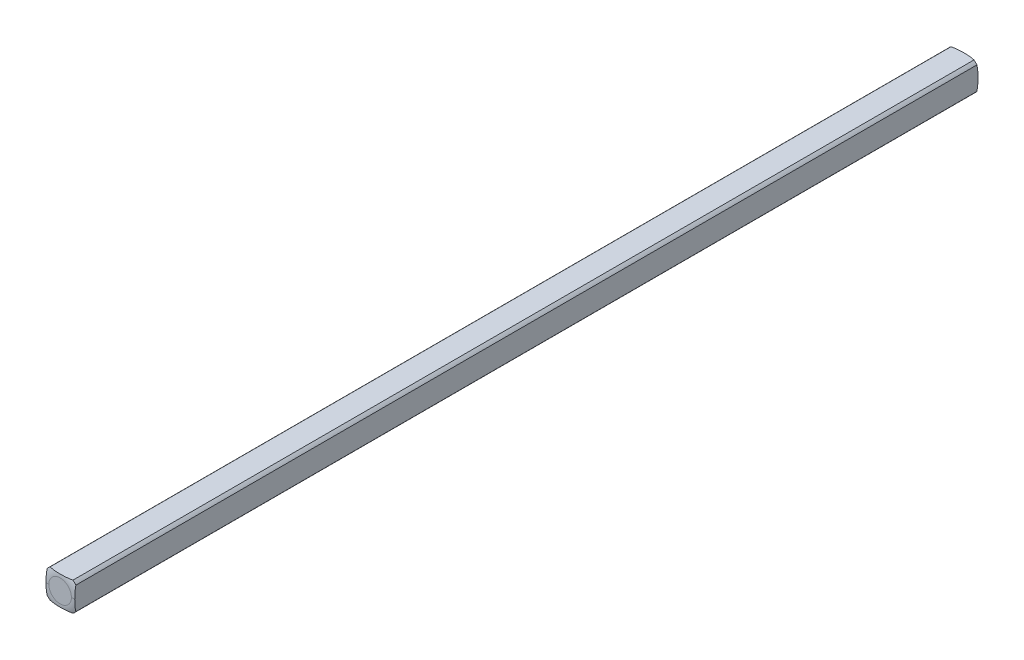
ISO-10303-21;
HEADER;
FILE_DESCRIPTION(('STEP AP214'),'2;1');
FILE_NAME('part.step','',(''),(''),'','','');
FILE_SCHEMA(('AUTOMOTIVE_DESIGN { 1 0 10303 214 1 1 1 1 }'));
ENDSEC;
DATA;
#1=APPLICATION_CONTEXT('core data for automotive mechanical design processes');
#2=APPLICATION_PROTOCOL_DEFINITION('international standard','automotive_design',2000,#1);
#3=PRODUCT_CONTEXT('',#1,'mechanical');
#4=PRODUCT('Part','Part','',(#3));
#5=PRODUCT_RELATED_PRODUCT_CATEGORY('part','',(#4));
#6=PRODUCT_DEFINITION_FORMATION('','',#4);
#7=PRODUCT_DEFINITION_CONTEXT('part definition',#1,'design');
#8=PRODUCT_DEFINITION('design','',#6,#7);
#9=PRODUCT_DEFINITION_SHAPE('','',#8);
#10=(LENGTH_UNIT() NAMED_UNIT(*) SI_UNIT(.MILLI.,.METRE.));
#11=(NAMED_UNIT(*) PLANE_ANGLE_UNIT() SI_UNIT($,.RADIAN.));
#12=(NAMED_UNIT(*) SI_UNIT($,.STERADIAN.) SOLID_ANGLE_UNIT());
#13=UNCERTAINTY_MEASURE_WITH_UNIT(LENGTH_MEASURE(1.E-05),#10,'distance_accuracy_value','');
#14=(GEOMETRIC_REPRESENTATION_CONTEXT(3) GLOBAL_UNCERTAINTY_ASSIGNED_CONTEXT((#13)) GLOBAL_UNIT_ASSIGNED_CONTEXT((#10,
#11,#12)) REPRESENTATION_CONTEXT('',''));
#15=CARTESIAN_POINT('',(0.,0.,0.));
#16=DIRECTION('',(0.,0.,1.));
#17=DIRECTION('',(1.,0.,0.));
#18=AXIS2_PLACEMENT_3D('',#15,#16,#17);
#19=CARTESIAN_POINT('',(0.,0.,-49.911));
#20=DIRECTION('',(0.,0.,1.));
#21=DIRECTION('',(1.,0.,0.));
#22=AXIS2_PLACEMENT_3D('',#19,#20,#21);
#23=CYLINDRICAL_SURFACE('',#22,2.032);
#24=CARTESIAN_POINT('',(0.,0.,-49.759919142098));
#25=DIRECTION('',(0.,0.,1.));
#26=DIRECTION('',(1.,0.,0.));
#27=AXIS2_PLACEMENT_3D('',#24,#25,#26);
#28=CIRCLE('',#27,2.032);
#29=CARTESIAN_POINT('',(-1.26841150657032,1.5875,-49.759919142098));
#30=VERTEX_POINT('',#29);
#31=CARTESIAN_POINT('',(-1.5875,1.26841150657032,-49.759919142098));
#32=VERTEX_POINT('',#31);
#33=EDGE_CURVE('E261',#30,#32,#28,.T.);
#34=ORIENTED_EDGE('',*,*,#33,.T.);
#35=DIRECTION('',(0.,0.,1.));
#36=VECTOR('',#35,1.);
#37=CARTESIAN_POINT('',(-1.5875,1.26841150657032,-49.911));
#38=LINE('',#37,#36);
#39=CARTESIAN_POINT('',(-1.5875,1.26841150657032,49.759919142098));
#40=VERTEX_POINT('',#39);
#41=EDGE_CURVE('E182',#32,#40,#38,.T.);
#42=ORIENTED_EDGE('',*,*,#41,.T.);
#43=CARTESIAN_POINT('',(0.,0.,49.759919142098));
#44=DIRECTION('',(0.,0.,-1.));
#45=DIRECTION('',(-1.,0.,0.));
#46=AXIS2_PLACEMENT_3D('',#43,#44,#45);
#47=CIRCLE('',#46,2.032);
#48=CARTESIAN_POINT('',(-1.26841150657032,1.5875,49.759919142098));
#49=VERTEX_POINT('',#48);
#50=EDGE_CURVE('E9',#40,#49,#47,.T.);
#51=ORIENTED_EDGE('',*,*,#50,.T.);
#52=DIRECTION('',(0.,0.,-1.));
#53=VECTOR('',#52,1.);
#54=CARTESIAN_POINT('',(-1.26841150657032,1.5875,-49.911));
#55=LINE('',#54,#53);
#56=EDGE_CURVE('E452',#49,#30,#55,.T.);
#57=ORIENTED_EDGE('',*,*,#56,.T.);
#58=EDGE_LOOP('',(#34,#42,#51,#57));
#59=FACE_BOUND('',#58,.T.);
#60=ADVANCED_FACE('F15',(#59),#23,.T.);
#61=CARTESIAN_POINT('',(0.,0.,-49.911));
#62=DIRECTION('',(0.,0.,1.));
#63=DIRECTION('',(1.,0.,0.));
#64=AXIS2_PLACEMENT_3D('',#61,#62,#63);
#65=CYLINDRICAL_SURFACE('',#64,2.032);
#66=CARTESIAN_POINT('',(0.,0.,-49.759919142098));
#67=DIRECTION('',(0.,0.,1.));
#68=DIRECTION('',(1.,0.,0.));
#69=AXIS2_PLACEMENT_3D('',#66,#67,#68);
#70=CIRCLE('',#69,2.032);
#71=CARTESIAN_POINT('',(1.5875,1.26841150657032,-49.759919142098));
#72=VERTEX_POINT('',#71);
#73=CARTESIAN_POINT('',(1.26841150657032,1.5875,-49.759919142098));
#74=VERTEX_POINT('',#73);
#75=EDGE_CURVE('E280',#72,#74,#70,.T.);
#76=ORIENTED_EDGE('',*,*,#75,.T.);
#77=DIRECTION('',(0.,0.,1.));
#78=VECTOR('',#77,1.);
#79=CARTESIAN_POINT('',(1.26841150657032,1.5875,-49.911));
#80=LINE('',#79,#78);
#81=CARTESIAN_POINT('',(1.26841150657032,1.5875,49.759919142098));
#82=VERTEX_POINT('',#81);
#83=EDGE_CURVE('E447',#74,#82,#80,.T.);
#84=ORIENTED_EDGE('',*,*,#83,.T.);
#85=CARTESIAN_POINT('',(0.,0.,49.759919142098));
#86=DIRECTION('',(0.,0.,-1.));
#87=DIRECTION('',(-1.,0.,0.));
#88=AXIS2_PLACEMENT_3D('',#85,#86,#87);
#89=CIRCLE('',#88,2.032);
#90=CARTESIAN_POINT('',(1.5875,1.26841150657032,49.759919142098));
#91=VERTEX_POINT('',#90);
#92=EDGE_CURVE('E30',#82,#91,#89,.T.);
#93=ORIENTED_EDGE('',*,*,#92,.T.);
#94=DIRECTION('',(0.,0.,-1.));
#95=VECTOR('',#94,1.);
#96=CARTESIAN_POINT('',(1.5875,1.26841150657032,-49.911));
#97=LINE('',#96,#95);
#98=EDGE_CURVE('E434',#91,#72,#97,.T.);
#99=ORIENTED_EDGE('',*,*,#98,.T.);
#100=EDGE_LOOP('',(#76,#84,#93,#99));
#101=FACE_BOUND('',#100,.T.);
#102=ADVANCED_FACE('F247',(#101),#65,.T.);
#103=CARTESIAN_POINT('',(0.,0.,-49.911));
#104=DIRECTION('',(0.,0.,1.));
#105=DIRECTION('',(1.,0.,0.));
#106=AXIS2_PLACEMENT_3D('',#103,#104,#105);
#107=CYLINDRICAL_SURFACE('',#106,2.032);
#108=CARTESIAN_POINT('',(0.,0.,-49.759919142098));
#109=DIRECTION('',(0.,0.,1.));
#110=DIRECTION('',(1.,0.,0.));
#111=AXIS2_PLACEMENT_3D('',#108,#109,#110);
#112=CIRCLE('',#111,2.032);
#113=CARTESIAN_POINT('',(1.26841150657032,-1.5875,-49.759919142098));
#114=VERTEX_POINT('',#113);
#115=CARTESIAN_POINT('',(1.5875,-1.26841150657032,-49.759919142098));
#116=VERTEX_POINT('',#115);
#117=EDGE_CURVE('E352',#114,#116,#112,.T.);
#118=ORIENTED_EDGE('',*,*,#117,.T.);
#119=DIRECTION('',(0.,0.,1.));
#120=VECTOR('',#119,1.);
#121=CARTESIAN_POINT('',(1.5875,-1.26841150657032,-49.911));
#122=LINE('',#121,#120);
#123=CARTESIAN_POINT('',(1.5875,-1.26841150657032,49.759919142098));
#124=VERTEX_POINT('',#123);
#125=EDGE_CURVE('E365',#116,#124,#122,.T.);
#126=ORIENTED_EDGE('',*,*,#125,.T.);
#127=CARTESIAN_POINT('',(0.,0.,49.759919142098));
#128=DIRECTION('',(0.,0.,-1.));
#129=DIRECTION('',(-1.,0.,0.));
#130=AXIS2_PLACEMENT_3D('',#127,#128,#129);
#131=CIRCLE('',#130,2.032);
#132=CARTESIAN_POINT('',(1.26841150657032,-1.5875,49.759919142098));
#133=VERTEX_POINT('',#132);
#134=EDGE_CURVE('E782',#124,#133,#131,.T.);
#135=ORIENTED_EDGE('',*,*,#134,.T.);
#136=DIRECTION('',(0.,0.,-1.));
#137=VECTOR('',#136,1.);
#138=CARTESIAN_POINT('',(1.26841150657032,-1.5875,-49.911));
#139=LINE('',#138,#137);
#140=EDGE_CURVE('E369',#133,#114,#139,.T.);
#141=ORIENTED_EDGE('',*,*,#140,.T.);
#142=EDGE_LOOP('',(#118,#126,#135,#141));
#143=FACE_BOUND('',#142,.T.);
#144=ADVANCED_FACE('F17',(#143),#107,.T.);
#145=CARTESIAN_POINT('',(0.,0.,-49.911));
#146=DIRECTION('',(0.,0.,1.));
#147=DIRECTION('',(1.,0.,0.));
#148=AXIS2_PLACEMENT_3D('',#145,#146,#147);
#149=CYLINDRICAL_SURFACE('',#148,2.032);
#150=CARTESIAN_POINT('',(0.,0.,-49.759919142098));
#151=DIRECTION('',(0.,0.,1.));
#152=DIRECTION('',(1.,0.,0.));
#153=AXIS2_PLACEMENT_3D('',#150,#151,#152);
#154=CIRCLE('',#153,2.032);
#155=CARTESIAN_POINT('',(-1.5875,-1.26841150657032,-49.759919142098));
#156=VERTEX_POINT('',#155);
#157=CARTESIAN_POINT('',(-1.26841150657032,-1.5875,-49.759919142098));
#158=VERTEX_POINT('',#157);
#159=EDGE_CURVE('E361',#156,#158,#154,.T.);
#160=ORIENTED_EDGE('',*,*,#159,.T.);
#161=DIRECTION('',(0.,0.,1.));
#162=VECTOR('',#161,1.);
#163=CARTESIAN_POINT('',(-1.26841150657032,-1.5875,-49.911));
#164=LINE('',#163,#162);
#165=CARTESIAN_POINT('',(-1.26841150657032,-1.5875,49.759919142098));
#166=VERTEX_POINT('',#165);
#167=EDGE_CURVE('E150',#158,#166,#164,.T.);
#168=ORIENTED_EDGE('',*,*,#167,.T.);
#169=CARTESIAN_POINT('',(0.,0.,49.759919142098));
#170=DIRECTION('',(0.,0.,-1.));
#171=DIRECTION('',(-1.,0.,0.));
#172=AXIS2_PLACEMENT_3D('',#169,#170,#171);
#173=CIRCLE('',#172,2.032);
#174=CARTESIAN_POINT('',(-1.5875,-1.26841150657032,49.759919142098));
#175=VERTEX_POINT('',#174);
#176=EDGE_CURVE('E165',#166,#175,#173,.T.);
#177=ORIENTED_EDGE('',*,*,#176,.T.);
#178=DIRECTION('',(0.,0.,-1.));
#179=VECTOR('',#178,1.);
#180=CARTESIAN_POINT('',(-1.5875,-1.26841150657032,-49.911));
#181=LINE('',#180,#179);
#182=EDGE_CURVE('E146',#175,#156,#181,.T.);
#183=ORIENTED_EDGE('',*,*,#182,.T.);
#184=EDGE_LOOP('',(#160,#168,#177,#183));
#185=FACE_BOUND('',#184,.T.);
#186=ADVANCED_FACE('F206',(#185),#149,.T.);
#187=CARTESIAN_POINT('',(-1.5875,1.5875,49.911));
#188=DIRECTION('',(0.,0.,-1.));
#189=DIRECTION('',(0.,-1.,0.));
#190=AXIS2_PLACEMENT_3D('',#187,#188,#189);
#191=PLANE('',#190);
#192=CARTESIAN_POINT('',(0.,0.,49.911));
#193=DIRECTION('',(0.,0.,1.));
#194=DIRECTION('',(1.,0.,0.));
#195=AXIS2_PLACEMENT_3D('',#192,#193,#194);
#196=CIRCLE('',#195,1.24506403026729);
#197=CARTESIAN_POINT('',(1.24506403026729,0.,49.911));
#198=VERTEX_POINT('',#197);
#199=CARTESIAN_POINT('',(-1.24506403026729,0.,49.911));
#200=VERTEX_POINT('',#199);
#201=EDGE_CURVE('E399',#198,#200,#196,.T.);
#202=ORIENTED_EDGE('',*,*,#201,.T.);
#203=CARTESIAN_POINT('',(0.,0.,49.911));
#204=DIRECTION('',(0.,0.,1.));
#205=DIRECTION('',(1.,0.,0.));
#206=AXIS2_PLACEMENT_3D('',#203,#204,#205);
#207=CIRCLE('',#206,1.24506403026729);
#208=EDGE_CURVE('E168',#200,#198,#207,.T.);
#209=ORIENTED_EDGE('',*,*,#208,.T.);
#210=EDGE_LOOP('',(#202,#209));
#211=FACE_BOUND('',#210,.T.);
#212=ADVANCED_FACE('F537',(#211),#191,.F.);
#213=CARTESIAN_POINT('',(-1.5875,1.5875,-49.911));
#214=DIRECTION('',(0.,0.,-1.));
#215=DIRECTION('',(0.,-1.,0.));
#216=AXIS2_PLACEMENT_3D('',#213,#214,#215);
#217=PLANE('',#216);
#218=CARTESIAN_POINT('',(0.,0.,-49.911));
#219=DIRECTION('',(0.,0.,1.));
#220=DIRECTION('',(1.,0.,0.));
#221=AXIS2_PLACEMENT_3D('',#218,#219,#220);
#222=CIRCLE('',#221,1.24506403026729);
#223=CARTESIAN_POINT('',(1.24506403026729,0.,-49.911));
#224=VERTEX_POINT('',#223);
#225=CARTESIAN_POINT('',(-1.24506403026729,0.,-49.911));
#226=VERTEX_POINT('',#225);
#227=EDGE_CURVE('E283',#224,#226,#222,.T.);
#228=ORIENTED_EDGE('',*,*,#227,.F.);
#229=CARTESIAN_POINT('',(0.,0.,-49.911));
#230=DIRECTION('',(0.,0.,1.));
#231=DIRECTION('',(1.,0.,0.));
#232=AXIS2_PLACEMENT_3D('',#229,#230,#231);
#233=CIRCLE('',#232,1.24506403026729);
#234=EDGE_CURVE('E362',#226,#224,#233,.T.);
#235=ORIENTED_EDGE('',*,*,#234,.F.);
#236=EDGE_LOOP('',(#228,#235));
#237=FACE_BOUND('',#236,.T.);
#238=ADVANCED_FACE('F547',(#237),#217,.T.);
#239=CARTESIAN_POINT('',(0.,0.,47.786));
#240=DIRECTION('',(0.,0.,-1.));
#241=DIRECTION('',(1.,0.,0.));
#242=AXIS2_PLACEMENT_3D('',#239,#240,#241);
#243=DEGENERATE_TOROIDAL_SURFACE('',#242,1.24506403026729,2.125,.T.);
#244=CARTESIAN_POINT('',(-1.24506403026729,0.,47.786));
#245=DIRECTION('',(0.,-1.,0.));
#246=DIRECTION('',(1.,0.,0.));
#247=AXIS2_PLACEMENT_3D('',#244,#245,#246);
#248=CIRCLE('',#247,2.125);
#249=CARTESIAN_POINT('',(-1.5875,0.,49.8832273616929));
#250=VERTEX_POINT('',#249);
#251=EDGE_CURVE('E142',#200,#250,#248,.T.);
#252=ORIENTED_EDGE('',*,*,#251,.F.);
#253=ORIENTED_EDGE('',*,*,#201,.F.);
#254=CARTESIAN_POINT('',(1.24506403026729,0.,47.786));
#255=DIRECTION('',(0.,1.,0.));
#256=DIRECTION('',(0.,0.,1.));
#257=AXIS2_PLACEMENT_3D('',#254,#255,#256);
#258=CIRCLE('',#257,2.125);
#259=CARTESIAN_POINT('',(1.5875,0.,49.8832273616929));
#260=VERTEX_POINT('',#259);
#261=EDGE_CURVE('E289',#198,#260,#258,.T.);
#262=ORIENTED_EDGE('',*,*,#261,.T.);
#263=CARTESIAN_POINT('',(1.5875,1.26841150657033,49.759919142098));
#264=CARTESIAN_POINT('',(1.5875,0.98707709496877,49.8299306391209));
#265=CARTESIAN_POINT('',(1.5875,0.63953045901757,49.8591819538897));
#266=CARTESIAN_POINT('',(1.5875,0.353837297594205,49.8832273616929));
#267=CARTESIAN_POINT('',(1.5875,0.,49.8832273616929));
#268=B_SPLINE_CURVE_WITH_KNOTS('',2,(#263,#264,#265,#266,#267),.UNSPECIFIED.,.F.,.F.,(3,2,3),
(0.,0.5,1.),.UNSPECIFIED.);
#269=EDGE_CURVE('E438',#91,#260,#268,.T.);
#270=ORIENTED_EDGE('',*,*,#269,.F.);
#271=ORIENTED_EDGE('',*,*,#92,.F.);
#272=CARTESIAN_POINT('',(-1.26841150657032,1.5875,49.759919142098));
#273=CARTESIAN_POINT('',(-0.770338232179816,1.5875,49.8838672057874));
#274=CARTESIAN_POINT('',(0.00849337593367507,1.5875,49.8832236517902));
#275=CARTESIAN_POINT('',(0.77547099042891,1.5875,49.8825898928308));
#276=CARTESIAN_POINT('',(1.26841150657033,1.5875,49.759919142098));
#277=B_SPLINE_CURVE_WITH_KNOTS('',2,(#272,#273,#274,#275,#276),.UNSPECIFIED.,.F.,.F.,(3,2,3),
(0.,0.5,1.),.UNSPECIFIED.);
#278=EDGE_CURVE('E456',#49,#82,#277,.T.);
#279=ORIENTED_EDGE('',*,*,#278,.F.);
#280=ORIENTED_EDGE('',*,*,#50,.F.);
#281=CARTESIAN_POINT('',(-1.5875,0.,49.8832273616929));
#282=CARTESIAN_POINT('',(-1.5875,0.35317995728335,49.8832273616929));
#283=CARTESIAN_POINT('',(-1.5875,0.6395293222865,49.8591820494506));
#284=CARTESIAN_POINT('',(-1.5875,0.98666984317169,49.8300319857984));
#285=CARTESIAN_POINT('',(-1.5875,1.26841150657033,49.759919142098));
#286=B_SPLINE_CURVE_WITH_KNOTS('',2,(#281,#282,#283,#284,#285),.UNSPECIFIED.,.F.,.F.,(3,2,3),
(0.,0.5,1.),.UNSPECIFIED.);
#287=EDGE_CURVE('E139',#250,#40,#286,.T.);
#288=ORIENTED_EDGE('',*,*,#287,.F.);
#289=EDGE_LOOP('',(#252,#253,#262,#270,#271,#279,#280,#288));
#290=FACE_BOUND('',#289,.T.);
#291=ADVANCED_FACE('F141',(#290),#243,.T.);
#292=CARTESIAN_POINT('',(0.,0.,-47.786));
#293=DIRECTION('',(0.,0.,1.));
#294=DIRECTION('',(1.,0.,0.));
#295=AXIS2_PLACEMENT_3D('',#292,#293,#294);
#296=DEGENERATE_TOROIDAL_SURFACE('',#295,1.24506403026729,2.125,.T.);
#297=CARTESIAN_POINT('',(-1.24506403026729,0.,-47.786));
#298=DIRECTION('',(0.,1.,0.));
#299=DIRECTION('',(-1.,0.,0.));
#300=AXIS2_PLACEMENT_3D('',#297,#298,#299);
#301=CIRCLE('',#300,2.125);
#302=CARTESIAN_POINT('',(-1.5875,0.,-49.8832273616929));
#303=VERTEX_POINT('',#302);
#304=EDGE_CURVE('E276',#226,#303,#301,.T.);
#305=ORIENTED_EDGE('',*,*,#304,.F.);
#306=ORIENTED_EDGE('',*,*,#234,.T.);
#307=CARTESIAN_POINT('',(1.24506403026729,0.,-47.786));
#308=DIRECTION('',(0.,-1.,0.));
#309=DIRECTION('',(0.,0.,-1.));
#310=AXIS2_PLACEMENT_3D('',#307,#308,#309);
#311=CIRCLE('',#310,2.125);
#312=CARTESIAN_POINT('',(1.5875,0.,-49.8832273616929));
#313=VERTEX_POINT('',#312);
#314=EDGE_CURVE('E185',#224,#313,#311,.T.);
#315=ORIENTED_EDGE('',*,*,#314,.T.);
#316=CARTESIAN_POINT('',(1.5875,-1.26841150657032,-49.759919142098));
#317=CARTESIAN_POINT('',(1.5875,-0.987077094982329,-49.8299306391175));
#318=CARTESIAN_POINT('',(1.5875,-0.63953045901757,-49.8591819538897));
#319=CARTESIAN_POINT('',(1.5875,-0.35383729761608,-49.8832273616929));
#320=CARTESIAN_POINT('',(1.5875,0.,-49.8832273616929));
#321=B_SPLINE_CURVE_WITH_KNOTS('',2,(#316,#317,#318,#319,#320),.UNSPECIFIED.,.F.,.F.,(3,2,3),
(0.,0.5,1.),.UNSPECIFIED.);
#322=EDGE_CURVE('E348',#116,#313,#321,.T.);
#323=ORIENTED_EDGE('',*,*,#322,.F.);
#324=ORIENTED_EDGE('',*,*,#117,.F.);
#325=CARTESIAN_POINT('',(-1.26841150657032,-1.5875,-49.759919142098));
#326=CARTESIAN_POINT('',(-0.770338232243093,-1.5875,-49.8838672057716));
#327=CARTESIAN_POINT('',(0.00849337593367507,-1.5875,-49.8832236517903));
#328=CARTESIAN_POINT('',(0.77547099036584,-1.5875,-49.8825898928465));
#329=CARTESIAN_POINT('',(1.26841150657033,-1.5875,-49.759919142098));
#330=B_SPLINE_CURVE_WITH_KNOTS('',2,(#325,#326,#327,#328,#329),.UNSPECIFIED.,.F.,.F.,(3,2,3),
(0.,0.5,1.),.UNSPECIFIED.);
#331=EDGE_CURVE('E376',#158,#114,#330,.T.);
#332=ORIENTED_EDGE('',*,*,#331,.F.);
#333=ORIENTED_EDGE('',*,*,#159,.F.);
#334=CARTESIAN_POINT('',(-1.5875,0.,-49.8832273616929));
#335=CARTESIAN_POINT('',(-1.5875,-0.353179957370228,-49.8832273616929));
#336=CARTESIAN_POINT('',(-1.5875,-0.639529322286498,-49.8591820494506));
#337=CARTESIAN_POINT('',(-1.5875,-0.986669843225562,-49.830031985785));
#338=CARTESIAN_POINT('',(-1.5875,-1.26841150657032,-49.759919142098));
#339=B_SPLINE_CURVE_WITH_KNOTS('',2,(#334,#335,#336,#337,#338),.UNSPECIFIED.,.F.,.F.,(3,2,3),
(0.,0.5,1.),.UNSPECIFIED.);
#340=EDGE_CURVE('E183',#303,#156,#339,.T.);
#341=ORIENTED_EDGE('',*,*,#340,.F.);
#342=EDGE_LOOP('',(#305,#306,#315,#323,#324,#332,#333,#341));
#343=FACE_BOUND('',#342,.T.);
#344=ADVANCED_FACE('F207',(#343),#296,.T.);
#345=CARTESIAN_POINT('',(-1.5875,1.5875,49.911));
#346=DIRECTION('',(0.,-1.,0.));
#347=DIRECTION('',(0.,0.,-1.));
#348=AXIS2_PLACEMENT_3D('',#345,#346,#347);
#349=PLANE('',#348);
#350=ORIENTED_EDGE('',*,*,#83,.F.);
#351=CARTESIAN_POINT('',(1.26841150657033,1.5875,-49.759919142098));
#352=CARTESIAN_POINT('',(0.770338232243095,1.5875,-49.8838672057716));
#353=CARTESIAN_POINT('',(-0.00849337593366987,1.5875,-49.8832236517903));
#354=CARTESIAN_POINT('',(-0.775470990365838,1.5875,-49.8825898928465));
#355=CARTESIAN_POINT('',(-1.26841150657032,1.5875,-49.759919142098));
#356=B_SPLINE_CURVE_WITH_KNOTS('',2,(#351,#352,#353,#354,#355),.UNSPECIFIED.,.F.,.F.,(3,2,3),
(0.,0.5,1.),.UNSPECIFIED.);
#357=EDGE_CURVE('E266',#74,#30,#356,.T.);
#358=ORIENTED_EDGE('',*,*,#357,.T.);
#359=ORIENTED_EDGE('',*,*,#56,.F.);
#360=ORIENTED_EDGE('',*,*,#278,.T.);
#361=EDGE_LOOP('',(#350,#358,#359,#360));
#362=FACE_BOUND('',#361,.T.);
#363=ADVANCED_FACE('F321',(#362),#349,.F.);
#364=CARTESIAN_POINT('',(1.5875,-1.5875,49.911));
#365=DIRECTION('',(-1.,0.,0.));
#366=DIRECTION('',(0.,0.,1.));
#367=AXIS2_PLACEMENT_3D('',#364,#365,#366);
#368=PLANE('',#367);
#369=ORIENTED_EDGE('',*,*,#125,.F.);
#370=ORIENTED_EDGE('',*,*,#322,.T.);
#371=CARTESIAN_POINT('',(1.5875,0.,-49.8832273616929));
#372=CARTESIAN_POINT('',(1.5875,0.35317995737017,-49.8832273616929));
#373=CARTESIAN_POINT('',(1.5875,0.6395293222865,-49.8591820494506));
#374=CARTESIAN_POINT('',(1.5875,0.98666984322553,-49.830031985785));
#375=CARTESIAN_POINT('',(1.5875,1.26841150657033,-49.759919142098));
#376=B_SPLINE_CURVE_WITH_KNOTS('',2,(#371,#372,#373,#374,#375),.UNSPECIFIED.,.F.,.F.,(3,2,3),
(0.,0.5,1.),.UNSPECIFIED.);
#377=EDGE_CURVE('E307',#313,#72,#376,.T.);
#378=ORIENTED_EDGE('',*,*,#377,.T.);
#379=ORIENTED_EDGE('',*,*,#98,.F.);
#380=ORIENTED_EDGE('',*,*,#269,.T.);
#381=CARTESIAN_POINT('',(1.5875,0.,49.8832273616929));
#382=CARTESIAN_POINT('',(1.5875,-0.35317995734854,49.8832273616929));
#383=CARTESIAN_POINT('',(1.5875,-0.639529322286498,49.8591820494506));
#384=CARTESIAN_POINT('',(1.5875,-0.986669843212142,49.8300319857883));
#385=CARTESIAN_POINT('',(1.5875,-1.26841150657032,49.759919142098));
#386=B_SPLINE_CURVE_WITH_KNOTS('',2,(#381,#382,#383,#384,#385),.UNSPECIFIED.,.F.,.F.,(3,2,3),
(0.,0.5,1.),.UNSPECIFIED.);
#387=EDGE_CURVE('E774',#260,#124,#386,.T.);
#388=ORIENTED_EDGE('',*,*,#387,.T.);
#389=EDGE_LOOP('',(#369,#370,#378,#379,#380,#388));
#390=FACE_BOUND('',#389,.T.);
#391=ADVANCED_FACE('F315',(#390),#368,.F.);
#392=CARTESIAN_POINT('',(-1.5875,-1.5875,49.911));
#393=DIRECTION('',(0.,1.,0.));
#394=DIRECTION('',(1.,0.,0.));
#395=AXIS2_PLACEMENT_3D('',#392,#393,#394);
#396=PLANE('',#395);
#397=ORIENTED_EDGE('',*,*,#167,.F.);
#398=ORIENTED_EDGE('',*,*,#331,.T.);
#399=ORIENTED_EDGE('',*,*,#140,.F.);
#400=CARTESIAN_POINT('',(1.26841150657033,-1.5875,49.759919142098));
#401=CARTESIAN_POINT('',(0.770338232179815,-1.5875,49.8838672057874));
#402=CARTESIAN_POINT('',(-0.00849337593367486,-1.5875,49.8832236517902));
#403=CARTESIAN_POINT('',(-0.775470990428911,-1.5875,49.8825898928308));
#404=CARTESIAN_POINT('',(-1.26841150657032,-1.5875,49.759919142098));
#405=B_SPLINE_CURVE_WITH_KNOTS('',2,(#400,#401,#402,#403,#404),.UNSPECIFIED.,.F.,.F.,(3,2,3),
(0.,0.5,1.),.UNSPECIFIED.);
#406=EDGE_CURVE('E789',#133,#166,#405,.T.);
#407=ORIENTED_EDGE('',*,*,#406,.T.);
#408=EDGE_LOOP('',(#397,#398,#399,#407));
#409=FACE_BOUND('',#408,.T.);
#410=ADVANCED_FACE('F204',(#409),#396,.F.);
#411=CARTESIAN_POINT('',(-1.5875,-1.5875,49.911));
#412=DIRECTION('',(1.,0.,0.));
#413=DIRECTION('',(0.,1.,0.));
#414=AXIS2_PLACEMENT_3D('',#411,#412,#413);
#415=PLANE('',#414);
#416=ORIENTED_EDGE('',*,*,#41,.F.);
#417=CARTESIAN_POINT('',(-1.5875,1.26841150657033,-49.759919142098));
#418=CARTESIAN_POINT('',(-1.5875,0.98707709498231,-49.8299306391175));
#419=CARTESIAN_POINT('',(-1.5875,0.63953045901757,-49.8591819538897));
#420=CARTESIAN_POINT('',(-1.5875,0.353837297616055,-49.8832273616929));
#421=CARTESIAN_POINT('',(-1.5875,0.,-49.8832273616929));
#422=B_SPLINE_CURVE_WITH_KNOTS('',2,(#417,#418,#419,#420,#421),.UNSPECIFIED.,.F.,.F.,(3,2,3),
(0.,0.5,1.),.UNSPECIFIED.);
#423=EDGE_CURVE('E231',#32,#303,#422,.T.);
#424=ORIENTED_EDGE('',*,*,#423,.T.);
#425=ORIENTED_EDGE('',*,*,#340,.T.);
#426=ORIENTED_EDGE('',*,*,#182,.F.);
#427=CARTESIAN_POINT('',(-1.5875,-1.26841150657032,49.759919142098));
#428=CARTESIAN_POINT('',(-1.5875,-0.987077094968787,49.8299306391209));
#429=CARTESIAN_POINT('',(-1.5875,-0.63953045901757,49.8591819538897));
#430=CARTESIAN_POINT('',(-1.5875,-0.35383729759423,49.8832273616929));
#431=CARTESIAN_POINT('',(-1.5875,0.,49.8832273616929));
#432=B_SPLINE_CURVE_WITH_KNOTS('',2,(#427,#428,#429,#430,#431),.UNSPECIFIED.,.F.,.F.,(3,2,3),
(0.,0.5,1.),.UNSPECIFIED.);
#433=EDGE_CURVE('E151',#175,#250,#432,.T.);
#434=ORIENTED_EDGE('',*,*,#433,.T.);
#435=ORIENTED_EDGE('',*,*,#287,.T.);
#436=EDGE_LOOP('',(#416,#424,#425,#426,#434,#435));
#437=FACE_BOUND('',#436,.T.);
#438=ADVANCED_FACE('F154',(#437),#415,.F.);
#439=CARTESIAN_POINT('',(0.,0.,-47.786));
#440=DIRECTION('',(0.,0.,1.));
#441=DIRECTION('',(1.,0.,0.));
#442=AXIS2_PLACEMENT_3D('',#439,#440,#441);
#443=DEGENERATE_TOROIDAL_SURFACE('',#442,1.24506403026729,2.125,.T.);
#444=ORIENTED_EDGE('',*,*,#227,.T.);
#445=ORIENTED_EDGE('',*,*,#304,.T.);
#446=ORIENTED_EDGE('',*,*,#423,.F.);
#447=ORIENTED_EDGE('',*,*,#33,.F.);
#448=ORIENTED_EDGE('',*,*,#357,.F.);
#449=ORIENTED_EDGE('',*,*,#75,.F.);
#450=ORIENTED_EDGE('',*,*,#377,.F.);
#451=ORIENTED_EDGE('',*,*,#314,.F.);
#452=EDGE_LOOP('',(#444,#445,#446,#447,#448,#449,#450,#451));
#453=FACE_BOUND('',#452,.T.);
#454=ADVANCED_FACE('F203',(#453),#443,.T.);
#455=CARTESIAN_POINT('',(0.,0.,47.786));
#456=DIRECTION('',(0.,0.,-1.));
#457=DIRECTION('',(1.,0.,0.));
#458=AXIS2_PLACEMENT_3D('',#455,#456,#457);
#459=DEGENERATE_TOROIDAL_SURFACE('',#458,1.24506403026729,2.125,.T.);
#460=ORIENTED_EDGE('',*,*,#208,.F.);
#461=ORIENTED_EDGE('',*,*,#251,.T.);
#462=ORIENTED_EDGE('',*,*,#433,.F.);
#463=ORIENTED_EDGE('',*,*,#176,.F.);
#464=ORIENTED_EDGE('',*,*,#406,.F.);
#465=ORIENTED_EDGE('',*,*,#134,.F.);
#466=ORIENTED_EDGE('',*,*,#387,.F.);
#467=ORIENTED_EDGE('',*,*,#261,.F.);
#468=EDGE_LOOP('',(#460,#461,#462,#463,#464,#465,#466,#467));
#469=FACE_BOUND('',#468,.T.);
#470=ADVANCED_FACE('F164',(#469),#459,.T.);
#471=CLOSED_SHELL('',(#60,#102,#144,#186,#212,#238,#291,#344,#363,#391,#410,#438,#454,#470));
#472=MANIFOLD_SOLID_BREP('B1',#471);
#473=ADVANCED_BREP_SHAPE_REPRESENTATION('',(#18,#472),#14);
#474=SHAPE_DEFINITION_REPRESENTATION(#9,#473);
ENDSEC;
END-ISO-10303-21;
